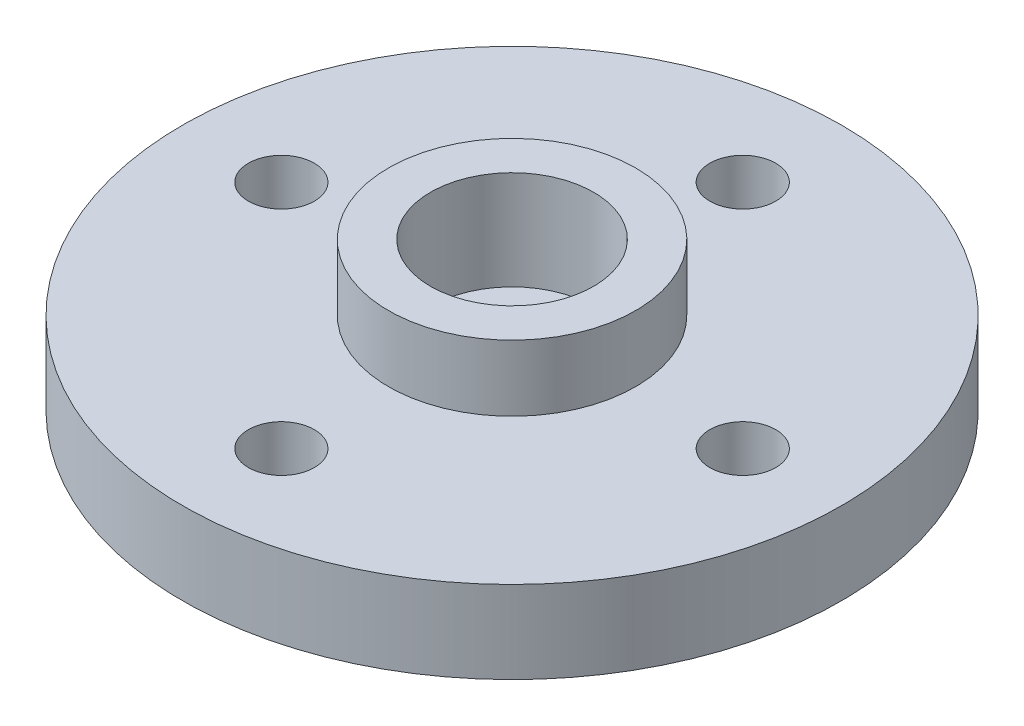
ISO-10303-21;
HEADER;
FILE_DESCRIPTION(('STEP AP214'),'2;1');
FILE_NAME('part.step','',(''),(''),'','','');
FILE_SCHEMA(('AUTOMOTIVE_DESIGN { 1 0 10303 214 1 1 1 1 }'));
ENDSEC;
DATA;
#1=APPLICATION_CONTEXT('core data for automotive mechanical design processes');
#2=APPLICATION_PROTOCOL_DEFINITION('international standard','automotive_design',2000,#1);
#3=PRODUCT_CONTEXT('',#1,'mechanical');
#4=PRODUCT('Part','Part','',(#3));
#5=PRODUCT_RELATED_PRODUCT_CATEGORY('part','',(#4));
#6=PRODUCT_DEFINITION_FORMATION('','',#4);
#7=PRODUCT_DEFINITION_CONTEXT('part definition',#1,'design');
#8=PRODUCT_DEFINITION('design','',#6,#7);
#9=PRODUCT_DEFINITION_SHAPE('','',#8);
#10=(LENGTH_UNIT() NAMED_UNIT(*) SI_UNIT(.MILLI.,.METRE.));
#11=(NAMED_UNIT(*) PLANE_ANGLE_UNIT() SI_UNIT($,.RADIAN.));
#12=(NAMED_UNIT(*) SI_UNIT($,.STERADIAN.) SOLID_ANGLE_UNIT());
#13=UNCERTAINTY_MEASURE_WITH_UNIT(LENGTH_MEASURE(1.E-05),#10,'distance_accuracy_value','');
#14=(GEOMETRIC_REPRESENTATION_CONTEXT(3) GLOBAL_UNCERTAINTY_ASSIGNED_CONTEXT((#13)) GLOBAL_UNIT_ASSIGNED_CONTEXT((#10,
#11,#12)) REPRESENTATION_CONTEXT('',''));
#15=CARTESIAN_POINT('',(0.,0.,0.));
#16=DIRECTION('',(0.,0.,1.));
#17=DIRECTION('',(1.,0.,0.));
#18=AXIS2_PLACEMENT_3D('',#15,#16,#17);
#19=CARTESIAN_POINT('',(0.,-5.5,0.));
#20=DIRECTION('',(0.,1.,0.));
#21=DIRECTION('',(0.,0.,1.));
#22=AXIS2_PLACEMENT_3D('',#19,#20,#21);
#23=CYLINDRICAL_SURFACE('',#22,1.2);
#24=CARTESIAN_POINT('',(0.,0.,0.));
#25=DIRECTION('',(0.,-1.,0.));
#26=DIRECTION('',(0.,0.,-1.));
#27=AXIS2_PLACEMENT_3D('',#24,#25,#26);
#28=CIRCLE('',#27,1.2);
#29=CARTESIAN_POINT('',(0.,0.,-1.2));
#30=VERTEX_POINT('',#29);
#31=EDGE_CURVE('E66',#30,#30,#28,.T.);
#32=ORIENTED_EDGE('',*,*,#31,.T.);
#33=EDGE_LOOP('',(#32));
#34=FACE_BOUND('',#33,.T.);
#35=CARTESIAN_POINT('',(0.,1.5,0.));
#36=DIRECTION('',(0.,1.,0.));
#37=DIRECTION('',(0.,0.,1.));
#38=AXIS2_PLACEMENT_3D('',#35,#36,#37);
#39=CIRCLE('',#38,1.2);
#40=CARTESIAN_POINT('',(0.,1.5,1.2));
#41=VERTEX_POINT('',#40);
#42=EDGE_CURVE('E62',#41,#41,#39,.F.);
#43=ORIENTED_EDGE('',*,*,#42,.F.);
#44=EDGE_LOOP('',(#43));
#45=FACE_BOUND('',#44,.T.);
#46=ADVANCED_FACE('F43',(#34,#45),#23,.F.);
#47=CARTESIAN_POINT('',(0.,0.,0.));
#48=DIRECTION('',(0.,-1.,0.));
#49=DIRECTION('',(0.,0.,-1.));
#50=AXIS2_PLACEMENT_3D('',#47,#48,#49);
#51=PLANE('',#50);
#52=CARTESIAN_POINT('',(7.,0.,0.));
#53=DIRECTION('',(0.,-1.,0.));
#54=DIRECTION('',(0.,0.,-1.));
#55=AXIS2_PLACEMENT_3D('',#52,#53,#54);
#56=CIRCLE('',#55,1.);
#57=CARTESIAN_POINT('',(7.,0.,-1.));
#58=VERTEX_POINT('',#57);
#59=EDGE_CURVE('E73',#58,#58,#56,.T.);
#60=ORIENTED_EDGE('',*,*,#59,.F.);
#61=EDGE_LOOP('',(#60));
#62=FACE_BOUND('',#61,.T.);
#63=CARTESIAN_POINT('',(0.,0.,-7.));
#64=DIRECTION('',(0.,-1.,0.));
#65=DIRECTION('',(0.,0.,-1.));
#66=AXIS2_PLACEMENT_3D('',#63,#64,#65);
#67=CIRCLE('',#66,0.999999999999998);
#68=CARTESIAN_POINT('',(0.,0.,-8.));
#69=VERTEX_POINT('',#68);
#70=EDGE_CURVE('E160',#69,#69,#67,.T.);
#71=ORIENTED_EDGE('',*,*,#70,.F.);
#72=EDGE_LOOP('',(#71));
#73=FACE_BOUND('',#72,.T.);
#74=CARTESIAN_POINT('',(-7.,0.,0.));
#75=DIRECTION('',(0.,-1.,0.));
#76=DIRECTION('',(0.,0.,-1.));
#77=AXIS2_PLACEMENT_3D('',#74,#75,#76);
#78=CIRCLE('',#77,0.999999999999999);
#79=CARTESIAN_POINT('',(-7.,0.,-1.));
#80=VERTEX_POINT('',#79);
#81=EDGE_CURVE('E164',#80,#80,#78,.T.);
#82=ORIENTED_EDGE('',*,*,#81,.F.);
#83=EDGE_LOOP('',(#82));
#84=FACE_BOUND('',#83,.T.);
#85=CARTESIAN_POINT('',(0.,0.,7.));
#86=DIRECTION('',(0.,-1.,0.));
#87=DIRECTION('',(0.,0.,-1.));
#88=AXIS2_PLACEMENT_3D('',#85,#86,#87);
#89=CIRCLE('',#88,1.);
#90=CARTESIAN_POINT('',(0.,0.,6.));
#91=VERTEX_POINT('',#90);
#92=EDGE_CURVE('E169',#91,#91,#89,.T.);
#93=ORIENTED_EDGE('',*,*,#92,.F.);
#94=EDGE_LOOP('',(#93));
#95=FACE_BOUND('',#94,.T.);
#96=ORIENTED_EDGE('',*,*,#31,.F.);
#97=EDGE_LOOP('',(#96));
#98=FACE_BOUND('',#97,.T.);
#99=CARTESIAN_POINT('',(0.,0.,0.));
#100=DIRECTION('',(0.,-1.,0.));
#101=DIRECTION('',(0.,0.,-1.));
#102=AXIS2_PLACEMENT_3D('',#99,#100,#101);
#103=CIRCLE('',#102,10.);
#104=CARTESIAN_POINT('',(0.,0.,-10.));
#105=VERTEX_POINT('',#104);
#106=EDGE_CURVE('E10',#105,#105,#103,.T.);
#107=ORIENTED_EDGE('',*,*,#106,.T.);
#108=EDGE_LOOP('',(#107));
#109=FACE_BOUND('',#108,.T.);
#110=ADVANCED_FACE('F45',(#62,#73,#84,#95,#98,#109),#51,.T.);
#111=CARTESIAN_POINT('',(0.,0.,0.));
#112=DIRECTION('',(0.,-1.,0.));
#113=DIRECTION('',(0.,0.,-1.));
#114=AXIS2_PLACEMENT_3D('',#111,#112,#113);
#115=CYLINDRICAL_SURFACE('',#114,10.);
#116=CARTESIAN_POINT('',(0.,2.5,0.));
#117=DIRECTION('',(0.,-1.,0.));
#118=DIRECTION('',(0.,0.,-1.));
#119=AXIS2_PLACEMENT_3D('',#116,#117,#118);
#120=CIRCLE('',#119,10.);
#121=CARTESIAN_POINT('',(0.,2.5,-10.));
#122=VERTEX_POINT('',#121);
#123=EDGE_CURVE('E52',#122,#122,#120,.T.);
#124=ORIENTED_EDGE('',*,*,#123,.T.);
#125=EDGE_LOOP('',(#124));
#126=FACE_BOUND('',#125,.T.);
#127=ORIENTED_EDGE('',*,*,#106,.F.);
#128=EDGE_LOOP('',(#127));
#129=FACE_BOUND('',#128,.T.);
#130=ADVANCED_FACE('F123',(#126,#129),#115,.T.);
#131=CARTESIAN_POINT('',(10.,2.5,0.));
#132=DIRECTION('',(0.,1.,0.));
#133=DIRECTION('',(0.,0.,1.));
#134=AXIS2_PLACEMENT_3D('',#131,#132,#133);
#135=PLANE('',#134);
#136=CARTESIAN_POINT('',(7.,2.5,0.));
#137=DIRECTION('',(0.,1.,0.));
#138=DIRECTION('',(0.,0.,1.));
#139=AXIS2_PLACEMENT_3D('',#136,#137,#138);
#140=CIRCLE('',#139,1.);
#141=CARTESIAN_POINT('',(7.,2.5,1.));
#142=VERTEX_POINT('',#141);
#143=EDGE_CURVE('E47',#142,#142,#140,.T.);
#144=ORIENTED_EDGE('',*,*,#143,.F.);
#145=EDGE_LOOP('',(#144));
#146=FACE_BOUND('',#145,.T.);
#147=CARTESIAN_POINT('',(0.,2.5,-7.));
#148=DIRECTION('',(0.,1.,0.));
#149=DIRECTION('',(0.,0.,1.));
#150=AXIS2_PLACEMENT_3D('',#147,#148,#149);
#151=CIRCLE('',#150,0.999999999999998);
#152=CARTESIAN_POINT('',(0.,2.5,-6.));
#153=VERTEX_POINT('',#152);
#154=EDGE_CURVE('E76',#153,#153,#151,.T.);
#155=ORIENTED_EDGE('',*,*,#154,.F.);
#156=EDGE_LOOP('',(#155));
#157=FACE_BOUND('',#156,.T.);
#158=CARTESIAN_POINT('',(-7.,2.5,0.));
#159=DIRECTION('',(0.,1.,0.));
#160=DIRECTION('',(0.,0.,1.));
#161=AXIS2_PLACEMENT_3D('',#158,#159,#160);
#162=CIRCLE('',#161,0.999999999999999);
#163=CARTESIAN_POINT('',(-7.,2.5,0.999999999999998));
#164=VERTEX_POINT('',#163);
#165=EDGE_CURVE('E72',#164,#164,#162,.T.);
#166=ORIENTED_EDGE('',*,*,#165,.F.);
#167=EDGE_LOOP('',(#166));
#168=FACE_BOUND('',#167,.T.);
#169=CARTESIAN_POINT('',(0.,2.5,7.));
#170=DIRECTION('',(0.,1.,0.));
#171=DIRECTION('',(0.,0.,1.));
#172=AXIS2_PLACEMENT_3D('',#169,#170,#171);
#173=CIRCLE('',#172,1.);
#174=CARTESIAN_POINT('',(0.,2.5,8.));
#175=VERTEX_POINT('',#174);
#176=EDGE_CURVE('E68',#175,#175,#173,.T.);
#177=ORIENTED_EDGE('',*,*,#176,.F.);
#178=EDGE_LOOP('',(#177));
#179=FACE_BOUND('',#178,.T.);
#180=CARTESIAN_POINT('',(0.,2.5,0.));
#181=DIRECTION('',(0.,-1.,0.));
#182=DIRECTION('',(0.,0.,-1.));
#183=AXIS2_PLACEMENT_3D('',#180,#181,#182);
#184=CIRCLE('',#183,3.75);
#185=CARTESIAN_POINT('',(0.,2.5,-3.75));
#186=VERTEX_POINT('',#185);
#187=EDGE_CURVE('E58',#186,#186,#184,.T.);
#188=ORIENTED_EDGE('',*,*,#187,.T.);
#189=EDGE_LOOP('',(#188));
#190=FACE_BOUND('',#189,.T.);
#191=ORIENTED_EDGE('',*,*,#123,.F.);
#192=EDGE_LOOP('',(#191));
#193=FACE_BOUND('',#192,.T.);
#194=ADVANCED_FACE('F106',(#146,#157,#168,#179,#190,#193),#135,.T.);
#195=CARTESIAN_POINT('',(0.,0.,0.));
#196=DIRECTION('',(0.,-1.,0.));
#197=DIRECTION('',(0.,0.,-1.));
#198=AXIS2_PLACEMENT_3D('',#195,#196,#197);
#199=CYLINDRICAL_SURFACE('',#198,3.75);
#200=CARTESIAN_POINT('',(0.,4.5,0.));
#201=DIRECTION('',(0.,-1.,0.));
#202=DIRECTION('',(0.,0.,-1.));
#203=AXIS2_PLACEMENT_3D('',#200,#201,#202);
#204=CIRCLE('',#203,3.75);
#205=CARTESIAN_POINT('',(0.,4.5,-3.75));
#206=VERTEX_POINT('',#205);
#207=EDGE_CURVE('E99',#206,#206,#204,.T.);
#208=ORIENTED_EDGE('',*,*,#207,.T.);
#209=EDGE_LOOP('',(#208));
#210=FACE_BOUND('',#209,.T.);
#211=ORIENTED_EDGE('',*,*,#187,.F.);
#212=EDGE_LOOP('',(#211));
#213=FACE_BOUND('',#212,.T.);
#214=ADVANCED_FACE('F109',(#210,#213),#199,.T.);
#215=CARTESIAN_POINT('',(3.75,4.5,0.));
#216=DIRECTION('',(0.,1.,0.));
#217=DIRECTION('',(0.,0.,1.));
#218=AXIS2_PLACEMENT_3D('',#215,#216,#217);
#219=PLANE('',#218);
#220=CARTESIAN_POINT('',(0.,4.5,0.));
#221=DIRECTION('',(0.,1.,0.));
#222=DIRECTION('',(0.,0.,1.));
#223=AXIS2_PLACEMENT_3D('',#220,#221,#222);
#224=CIRCLE('',#223,2.475);
#225=CARTESIAN_POINT('',(0.,4.5,2.475));
#226=VERTEX_POINT('',#225);
#227=EDGE_CURVE('E83',#226,#226,#224,.T.);
#228=ORIENTED_EDGE('',*,*,#227,.F.);
#229=EDGE_LOOP('',(#228));
#230=FACE_BOUND('',#229,.T.);
#231=ORIENTED_EDGE('',*,*,#207,.F.);
#232=EDGE_LOOP('',(#231));
#233=FACE_BOUND('',#232,.T.);
#234=ADVANCED_FACE('F111',(#230,#233),#219,.T.);
#235=CARTESIAN_POINT('',(0.,1.5,0.));
#236=DIRECTION('',(0.,1.,0.));
#237=DIRECTION('',(0.,0.,1.));
#238=AXIS2_PLACEMENT_3D('',#235,#236,#237);
#239=PLANE('',#238);
#240=CARTESIAN_POINT('',(0.,1.5,0.));
#241=DIRECTION('',(0.,1.,0.));
#242=DIRECTION('',(0.,0.,1.));
#243=AXIS2_PLACEMENT_3D('',#240,#241,#242);
#244=CIRCLE('',#243,2.475);
#245=CARTESIAN_POINT('',(0.,1.5,2.475));
#246=VERTEX_POINT('',#245);
#247=EDGE_CURVE('E67',#246,#246,#244,.T.);
#248=ORIENTED_EDGE('',*,*,#247,.T.);
#249=EDGE_LOOP('',(#248));
#250=FACE_BOUND('',#249,.T.);
#251=ORIENTED_EDGE('',*,*,#42,.T.);
#252=EDGE_LOOP('',(#251));
#253=FACE_BOUND('',#252,.T.);
#254=ADVANCED_FACE('F119',(#250,#253),#239,.T.);
#255=CARTESIAN_POINT('',(0.,1.5,0.));
#256=DIRECTION('',(0.,1.,0.));
#257=DIRECTION('',(0.,0.,1.));
#258=AXIS2_PLACEMENT_3D('',#255,#256,#257);
#259=CYLINDRICAL_SURFACE('',#258,2.475);
#260=ORIENTED_EDGE('',*,*,#247,.F.);
#261=EDGE_LOOP('',(#260));
#262=FACE_BOUND('',#261,.T.);
#263=ORIENTED_EDGE('',*,*,#227,.T.);
#264=EDGE_LOOP('',(#263));
#265=FACE_BOUND('',#264,.T.);
#266=ADVANCED_FACE('F134',(#262,#265),#259,.F.);
#267=CARTESIAN_POINT('',(0.,3.,7.));
#268=DIRECTION('',(0.,-1.,0.));
#269=DIRECTION('',(0.,0.,-1.));
#270=AXIS2_PLACEMENT_3D('',#267,#268,#269);
#271=CYLINDRICAL_SURFACE('',#270,1.);
#272=ORIENTED_EDGE('',*,*,#176,.T.);
#273=EDGE_LOOP('',(#272));
#274=FACE_BOUND('',#273,.T.);
#275=ORIENTED_EDGE('',*,*,#92,.T.);
#276=EDGE_LOOP('',(#275));
#277=FACE_BOUND('',#276,.T.);
#278=ADVANCED_FACE('F137',(#274,#277),#271,.F.);
#279=CARTESIAN_POINT('',(-7.,3.,0.));
#280=DIRECTION('',(0.,-1.,0.));
#281=DIRECTION('',(0.,0.,-1.));
#282=AXIS2_PLACEMENT_3D('',#279,#280,#281);
#283=CYLINDRICAL_SURFACE('',#282,0.999999999999999);
#284=ORIENTED_EDGE('',*,*,#165,.T.);
#285=EDGE_LOOP('',(#284));
#286=FACE_BOUND('',#285,.T.);
#287=ORIENTED_EDGE('',*,*,#81,.T.);
#288=EDGE_LOOP('',(#287));
#289=FACE_BOUND('',#288,.T.);
#290=ADVANCED_FACE('F144',(#286,#289),#283,.F.);
#291=CARTESIAN_POINT('',(0.,3.,-7.));
#292=DIRECTION('',(0.,-1.,0.));
#293=DIRECTION('',(0.,0.,-1.));
#294=AXIS2_PLACEMENT_3D('',#291,#292,#293);
#295=CYLINDRICAL_SURFACE('',#294,0.999999999999998);
#296=ORIENTED_EDGE('',*,*,#154,.T.);
#297=EDGE_LOOP('',(#296));
#298=FACE_BOUND('',#297,.T.);
#299=ORIENTED_EDGE('',*,*,#70,.T.);
#300=EDGE_LOOP('',(#299));
#301=FACE_BOUND('',#300,.T.);
#302=ADVANCED_FACE('F148',(#298,#301),#295,.F.);
#303=CARTESIAN_POINT('',(7.,3.,0.));
#304=DIRECTION('',(0.,-1.,0.));
#305=DIRECTION('',(0.,0.,-1.));
#306=AXIS2_PLACEMENT_3D('',#303,#304,#305);
#307=CYLINDRICAL_SURFACE('',#306,1.);
#308=ORIENTED_EDGE('',*,*,#143,.T.);
#309=EDGE_LOOP('',(#308));
#310=FACE_BOUND('',#309,.T.);
#311=ORIENTED_EDGE('',*,*,#59,.T.);
#312=EDGE_LOOP('',(#311));
#313=FACE_BOUND('',#312,.T.);
#314=ADVANCED_FACE('F152',(#310,#313),#307,.F.);
#315=CLOSED_SHELL('',(#46,#110,#130,#194,#214,#234,#254,#266,#278,#290,#302,#314));
#316=MANIFOLD_SOLID_BREP('B2',#315);
#317=ADVANCED_BREP_SHAPE_REPRESENTATION('',(#18,#316),#14);
#318=SHAPE_DEFINITION_REPRESENTATION(#9,#317);
ENDSEC;
END-ISO-10303-21;
